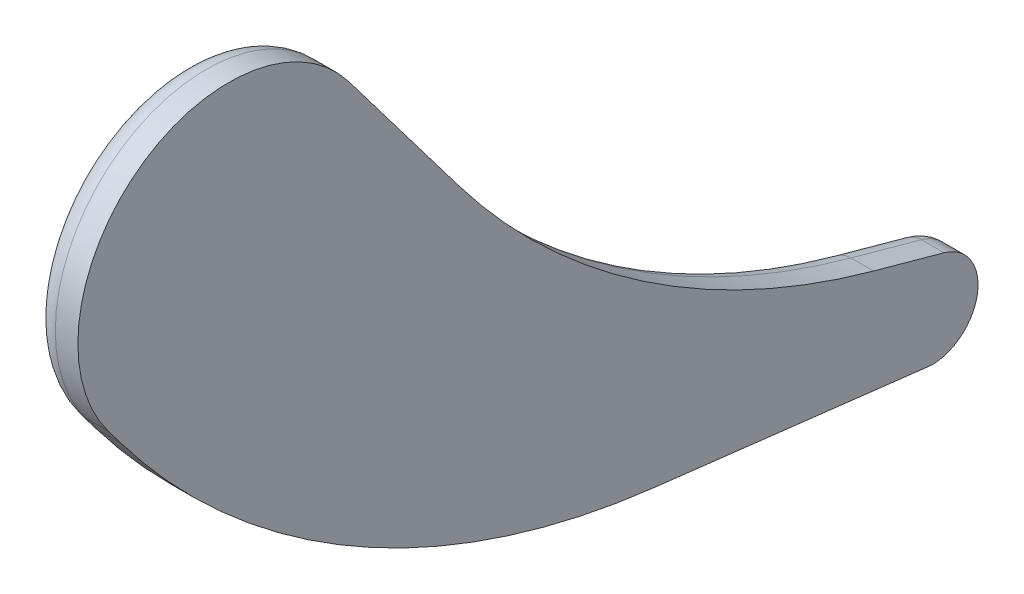
ISO-10303-21;
HEADER;
FILE_DESCRIPTION(('STEP AP214'),'2;1');
FILE_NAME('part.step','',(''),(''),'','','');
FILE_SCHEMA(('AUTOMOTIVE_DESIGN { 1 0 10303 214 1 1 1 1 }'));
ENDSEC;
DATA;
#1=APPLICATION_CONTEXT('core data for automotive mechanical design processes');
#2=APPLICATION_PROTOCOL_DEFINITION('international standard','automotive_design',2000,#1);
#3=PRODUCT_CONTEXT('',#1,'mechanical');
#4=PRODUCT('Part','Part','',(#3));
#5=PRODUCT_RELATED_PRODUCT_CATEGORY('part','',(#4));
#6=PRODUCT_DEFINITION_FORMATION('','',#4);
#7=PRODUCT_DEFINITION_CONTEXT('part definition',#1,'design');
#8=PRODUCT_DEFINITION('design','',#6,#7);
#9=PRODUCT_DEFINITION_SHAPE('','',#8);
#10=(LENGTH_UNIT() NAMED_UNIT(*) SI_UNIT(.MILLI.,.METRE.));
#11=(NAMED_UNIT(*) PLANE_ANGLE_UNIT() SI_UNIT($,.RADIAN.));
#12=(NAMED_UNIT(*) SI_UNIT($,.STERADIAN.) SOLID_ANGLE_UNIT());
#13=UNCERTAINTY_MEASURE_WITH_UNIT(LENGTH_MEASURE(1.E-05),#10,'distance_accuracy_value','');
#14=(GEOMETRIC_REPRESENTATION_CONTEXT(3) GLOBAL_UNCERTAINTY_ASSIGNED_CONTEXT((#13)) GLOBAL_UNIT_ASSIGNED_CONTEXT((#10,
#11,#12)) REPRESENTATION_CONTEXT('',''));
#15=CARTESIAN_POINT('',(0.,0.,0.));
#16=DIRECTION('',(0.,0.,1.));
#17=DIRECTION('',(1.,0.,0.));
#18=AXIS2_PLACEMENT_3D('',#15,#16,#17);
#19=CARTESIAN_POINT('',(4.064,61.3954938084868,-52.6908545838933));
#20=DIRECTION('',(-1.,0.,0.));
#21=DIRECTION('',(0.,0.,1.));
#22=AXIS2_PLACEMENT_3D('',#19,#20,#21);
#23=CYLINDRICAL_SURFACE('',#22,70.2571780129721);
#24=DIRECTION('',(-1.,0.,0.));
#25=VECTOR('',#24,1.);
#26=CARTESIAN_POINT('',(4.064,-6.33047493311499,-34.0022425338234));
#27=LINE('',#26,#25);
#28=CARTESIAN_POINT('',(4.064,-6.33047493311499,-34.0022425338234));
#29=VERTEX_POINT('',#28);
#30=CARTESIAN_POINT('',(2.032,-6.33047493311499,-34.0022425338234));
#31=VERTEX_POINT('',#30);
#32=EDGE_CURVE('E285',#29,#31,#27,.T.);
#33=ORIENTED_EDGE('',*,*,#32,.T.);
#34=CARTESIAN_POINT('',(2.032,61.3954938084868,-52.6908545838933));
#35=DIRECTION('',(1.,0.,0.));
#36=DIRECTION('',(0.,0.,-1.));
#37=AXIS2_PLACEMENT_3D('',#34,#35,#36);
#38=CIRCLE('',#37,70.2571780129721);
#39=CARTESIAN_POINT('',(2.032,18.9694256857444,3.31003653393499));
#40=VERTEX_POINT('',#39);
#41=EDGE_CURVE('E11',#31,#40,#38,.F.);
#42=ORIENTED_EDGE('',*,*,#41,.T.);
#43=DIRECTION('',(-1.,0.,0.));
#44=VECTOR('',#43,1.);
#45=CARTESIAN_POINT('',(4.064,18.9694256857444,3.31003653393499));
#46=LINE('',#45,#44);
#47=CARTESIAN_POINT('',(4.064,18.9694256857444,3.31003653393499));
#48=VERTEX_POINT('',#47);
#49=EDGE_CURVE('E313',#48,#40,#46,.T.);
#50=ORIENTED_EDGE('',*,*,#49,.F.);
#51=CARTESIAN_POINT('',(4.064,61.3954938084868,-52.6908545838933));
#52=DIRECTION('',(1.,0.,0.));
#53=DIRECTION('',(0.,0.,-1.));
#54=AXIS2_PLACEMENT_3D('',#51,#52,#53);
#55=CIRCLE('',#54,70.2571780129721);
#56=EDGE_CURVE('E257',#48,#29,#55,.T.);
#57=ORIENTED_EDGE('',*,*,#56,.T.);
#58=EDGE_LOOP('',(#33,#42,#50,#57));
#59=FACE_BOUND('',#58,.T.);
#60=ADVANCED_FACE('F46',(#59),#23,.F.);
#61=CARTESIAN_POINT('',(4.064,5.32409536328046,-7.02761528307115));
#62=DIRECTION('',(0.,0.603868093234675,-0.797084265290137));
#63=DIRECTION('',(0.,0.797084265290137,0.603868093234675));
#64=AXIS2_PLACEMENT_3D('',#61,#62,#63);
#65=PLANE('',#64);
#66=ORIENTED_EDGE('',*,*,#49,.T.);
#67=DIRECTION('',(0.,-0.797084265290137,-0.603868093234675));
#68=VECTOR('',#67,1.);
#69=CARTESIAN_POINT('',(2.032,31.9923804396434,13.1761789205946));
#70=LINE('',#69,#68);
#71=CARTESIAN_POINT('',(2.032,31.9923804396434,13.1761789205946));
#72=VERTEX_POINT('',#71);
#73=EDGE_CURVE('E342',#40,#72,#70,.F.);
#74=ORIENTED_EDGE('',*,*,#73,.T.);
#75=DIRECTION('',(-1.,0.,0.));
#76=VECTOR('',#75,1.);
#77=CARTESIAN_POINT('',(4.064,31.9923804396434,13.1761789205946));
#78=LINE('',#77,#76);
#79=CARTESIAN_POINT('',(4.064,31.9923804396434,13.1761789205946));
#80=VERTEX_POINT('',#79);
#81=EDGE_CURVE('E309',#80,#72,#78,.T.);
#82=ORIENTED_EDGE('',*,*,#81,.F.);
#83=DIRECTION('',(0.,-0.797084265290137,-0.603868093234675));
#84=VECTOR('',#83,1.);
#85=CARTESIAN_POINT('',(4.064,5.32409536328046,-7.02761528307115));
#86=LINE('',#85,#84);
#87=EDGE_CURVE('E261',#80,#48,#86,.T.);
#88=ORIENTED_EDGE('',*,*,#87,.T.);
#89=EDGE_LOOP('',(#66,#74,#82,#88));
#90=FACE_BOUND('',#89,.T.);
#91=ADVANCED_FACE('F407',(#90),#65,.T.);
#92=CARTESIAN_POINT('',(4.064,23.7918650694692,24.0005656402545));
#93=DIRECTION('',(-1.,0.,0.));
#94=DIRECTION('',(0.,0.,1.));
#95=AXIS2_PLACEMENT_3D('',#92,#93,#94);
#96=CYLINDRICAL_SURFACE('',#95,13.5799779157852);
#97=ORIENTED_EDGE('',*,*,#81,.T.);
#98=CARTESIAN_POINT('',(2.032,23.7918650694692,24.0005656402545));
#99=DIRECTION('',(1.,0.,0.));
#100=DIRECTION('',(0.,0.,-1.));
#101=AXIS2_PLACEMENT_3D('',#98,#99,#100);
#102=CIRCLE('',#101,13.5799779157852);
#103=CARTESIAN_POINT('',(2.032,15.6105357122038,34.8394608856731));
#104=VERTEX_POINT('',#103);
#105=EDGE_CURVE('E346',#72,#104,#102,.T.);
#106=ORIENTED_EDGE('',*,*,#105,.T.);
#107=DIRECTION('',(-1.,0.,0.));
#108=VECTOR('',#107,1.);
#109=CARTESIAN_POINT('',(4.064,15.6105357122038,34.8394608856731));
#110=LINE('',#109,#108);
#111=CARTESIAN_POINT('',(4.064,15.6105357122038,34.8394608856731));
#112=VERTEX_POINT('',#111);
#113=EDGE_CURVE('E305',#112,#104,#110,.T.);
#114=ORIENTED_EDGE('',*,*,#113,.F.);
#115=CARTESIAN_POINT('',(4.064,23.7918650694692,24.0005656402545));
#116=DIRECTION('',(1.,0.,0.));
#117=DIRECTION('',(0.,0.,-1.));
#118=AXIS2_PLACEMENT_3D('',#115,#116,#117);
#119=CIRCLE('',#118,13.5799779157852);
#120=EDGE_CURVE('E265',#80,#112,#119,.T.);
#121=ORIENTED_EDGE('',*,*,#120,.F.);
#122=EDGE_LOOP('',(#97,#106,#114,#121));
#123=FACE_BOUND('',#122,.T.);
#124=ADVANCED_FACE('F413',(#123),#96,.T.);
#125=CARTESIAN_POINT('',(4.064,-11.0867182492119,14.6880503731332));
#126=DIRECTION('',(0.,0.602455277026211,-0.798152641531224));
#127=DIRECTION('',(0.,0.798152641531224,0.602455277026211));
#128=AXIS2_PLACEMENT_3D('',#125,#126,#127);
#129=PLANE('',#128);
#130=ORIENTED_EDGE('',*,*,#113,.T.);
#131=DIRECTION('',(0.,-0.798152641531224,-0.602455277026211));
#132=VECTOR('',#131,1.);
#133=CARTESIAN_POINT('',(2.032,-11.0867182492119,14.6880503731332));
#134=LINE('',#133,#132);
#135=CARTESIAN_POINT('',(2.032,14.1277592112356,33.7202432308334));
#136=VERTEX_POINT('',#135);
#137=EDGE_CURVE('E349',#104,#136,#134,.T.);
#138=ORIENTED_EDGE('',*,*,#137,.T.);
#139=DIRECTION('',(-1.,0.,0.));
#140=VECTOR('',#139,1.);
#141=CARTESIAN_POINT('',(4.064,14.1277592112356,33.7202432308334));
#142=LINE('',#141,#140);
#143=CARTESIAN_POINT('',(4.064,14.1277592112356,33.7202432308334));
#144=VERTEX_POINT('',#143);
#145=EDGE_CURVE('E301',#144,#136,#142,.T.);
#146=ORIENTED_EDGE('',*,*,#145,.F.);
#147=DIRECTION('',(0.,-0.798152641531224,-0.602455277026211));
#148=VECTOR('',#147,1.);
#149=CARTESIAN_POINT('',(4.064,-11.0867182492119,14.6880503731332));
#150=LINE('',#149,#148);
#151=EDGE_CURVE('E268',#112,#144,#150,.T.);
#152=ORIENTED_EDGE('',*,*,#151,.F.);
#153=EDGE_LOOP('',(#130,#138,#146,#152));
#154=FACE_BOUND('',#153,.T.);
#155=ADVANCED_FACE('F476',(#154),#129,.F.);
#156=CARTESIAN_POINT('',(4.064,56.4545668541204,-22.3557089867498));
#157=DIRECTION('',(-1.,0.,0.));
#158=DIRECTION('',(0.,0.,1.));
#159=AXIS2_PLACEMENT_3D('',#156,#157,#158);
#160=CYLINDRICAL_SURFACE('',#159,70.2571780129719);
#161=ORIENTED_EDGE('',*,*,#145,.T.);
#162=CARTESIAN_POINT('',(2.032,56.4545668541204,-22.3557089867498));
#163=DIRECTION('',(1.,0.,0.));
#164=DIRECTION('',(0.,0.,-1.));
#165=AXIS2_PLACEMENT_3D('',#162,#163,#164);
#166=CIRCLE('',#165,70.2571780129719);
#167=CARTESIAN_POINT('',(2.032,-13.3195793217241,-14.1313799698464));
#168=VERTEX_POINT('',#167);
#169=EDGE_CURVE('E352',#136,#168,#166,.T.);
#170=ORIENTED_EDGE('',*,*,#169,.T.);
#171=DIRECTION('',(-1.,0.,0.));
#172=VECTOR('',#171,1.);
#173=CARTESIAN_POINT('',(4.064,-13.3195793217241,-14.1313799698464));
#174=LINE('',#173,#172);
#175=CARTESIAN_POINT('',(4.064,-13.3195793217241,-14.1313799698464));
#176=VERTEX_POINT('',#175);
#177=EDGE_CURVE('E297',#176,#168,#174,.T.);
#178=ORIENTED_EDGE('',*,*,#177,.F.);
#179=CARTESIAN_POINT('',(4.064,56.4545668541204,-22.3557089867498));
#180=DIRECTION('',(1.,0.,0.));
#181=DIRECTION('',(0.,0.,-1.));
#182=AXIS2_PLACEMENT_3D('',#179,#180,#181);
#183=CIRCLE('',#182,70.2571780129719);
#184=EDGE_CURVE('E271',#176,#144,#183,.F.);
#185=ORIENTED_EDGE('',*,*,#184,.T.);
#186=EDGE_LOOP('',(#161,#170,#178,#185));
#187=FACE_BOUND('',#186,.T.);
#188=ADVANCED_FACE('F449',(#187),#160,.T.);
#189=CARTESIAN_POINT('',(4.064,-11.4942084872456,1.35483065818888));
#190=DIRECTION('',(0.,0.993124804457162,-0.117060338167646));
#191=DIRECTION('',(0.,0.117060338167646,0.993124804457162));
#192=AXIS2_PLACEMENT_3D('',#189,#190,#191);
#193=PLANE('',#192);
#194=ORIENTED_EDGE('',*,*,#177,.T.);
#195=DIRECTION('',(0.,-0.117060338167646,-0.993124804457162));
#196=VECTOR('',#195,1.);
#197=CARTESIAN_POINT('',(2.032,-11.4942084872456,1.35483065818888));
#198=LINE('',#197,#196);
#199=CARTESIAN_POINT('',(2.032,-16.2786445212172,-39.2357073075474));
#200=VERTEX_POINT('',#199);
#201=EDGE_CURVE('E355',#168,#200,#198,.T.);
#202=ORIENTED_EDGE('',*,*,#201,.T.);
#203=DIRECTION('',(-1.,0.,0.));
#204=VECTOR('',#203,1.);
#205=CARTESIAN_POINT('',(4.064,-16.2786445212172,-39.2357073075474));
#206=LINE('',#205,#204);
#207=CARTESIAN_POINT('',(4.064,-16.2786445212172,-39.2357073075474));
#208=VERTEX_POINT('',#207);
#209=EDGE_CURVE('E293',#208,#200,#206,.T.);
#210=ORIENTED_EDGE('',*,*,#209,.F.);
#211=DIRECTION('',(0.,-0.117060338167646,-0.993124804457162));
#212=VECTOR('',#211,1.);
#213=CARTESIAN_POINT('',(4.064,-11.4942084872456,1.35483065818888));
#214=LINE('',#213,#212);
#215=EDGE_CURVE('E275',#176,#208,#214,.T.);
#216=ORIENTED_EDGE('',*,*,#215,.F.);
#217=EDGE_LOOP('',(#194,#202,#210,#216));
#218=FACE_BOUND('',#217,.T.);
#219=ADVANCED_FACE('F454',(#218),#193,.F.);
#220=CARTESIAN_POINT('',(4.064,-12.1046331055293,-39.2357073075474));
#221=DIRECTION('',(-1.,0.,0.));
#222=DIRECTION('',(0.,0.,1.));
#223=AXIS2_PLACEMENT_3D('',#220,#221,#222);
#224=CYLINDRICAL_SURFACE('',#223,4.17401141568788);
#225=ORIENTED_EDGE('',*,*,#209,.T.);
#226=CARTESIAN_POINT('',(2.032,-12.1046331055293,-39.2357073075474));
#227=DIRECTION('',(1.,0.,0.));
#228=DIRECTION('',(0.,0.,-1.));
#229=AXIS2_PLACEMENT_3D('',#226,#227,#228);
#230=CIRCLE('',#229,4.17401141568788);
#231=CARTESIAN_POINT('',(2.032,-8.08100200247289,-40.346006386539));
#232=VERTEX_POINT('',#231);
#233=EDGE_CURVE('E358',#200,#232,#230,.T.);
#234=ORIENTED_EDGE('',*,*,#233,.T.);
#235=DIRECTION('',(-1.,0.,0.));
#236=VECTOR('',#235,1.);
#237=CARTESIAN_POINT('',(4.064,-8.08100200247289,-40.346006386539));
#238=LINE('',#237,#236);
#239=CARTESIAN_POINT('',(4.064,-8.08100200247289,-40.346006386539));
#240=VERTEX_POINT('',#239);
#241=EDGE_CURVE('E289',#240,#232,#238,.T.);
#242=ORIENTED_EDGE('',*,*,#241,.F.);
#243=CARTESIAN_POINT('',(4.064,-12.1046331055293,-39.2357073075474));
#244=DIRECTION('',(1.,0.,0.));
#245=DIRECTION('',(0.,0.,-1.));
#246=AXIS2_PLACEMENT_3D('',#243,#244,#245);
#247=CIRCLE('',#246,4.17401141568788);
#248=EDGE_CURVE('E278',#208,#240,#247,.T.);
#249=ORIENTED_EDGE('',*,*,#248,.F.);
#250=EDGE_LOOP('',(#225,#234,#242,#249));
#251=FACE_BOUND('',#250,.T.);
#252=ADVANCED_FACE('F464',(#251),#224,.T.);
#253=CARTESIAN_POINT('',(4.064,2.83628832722713,-0.78265830957587));
#254=DIRECTION('',(0.,0.963972232546787,-0.266002885094809));
#255=DIRECTION('',(0.,0.266002885094809,0.963972232546788));
#256=AXIS2_PLACEMENT_3D('',#253,#254,#255);
#257=PLANE('',#256);
#258=ORIENTED_EDGE('',*,*,#241,.T.);
#259=DIRECTION('',(0.,-0.266002885094809,-0.963972232546788));
#260=VECTOR('',#259,1.);
#261=CARTESIAN_POINT('',(2.032,-6.330474933115,-34.0022425338234));
#262=LINE('',#261,#260);
#263=EDGE_CURVE('E56',#232,#31,#262,.F.);
#264=ORIENTED_EDGE('',*,*,#263,.T.);
#265=ORIENTED_EDGE('',*,*,#32,.F.);
#266=DIRECTION('',(0.,-0.266002885094809,-0.963972232546788));
#267=VECTOR('',#266,1.);
#268=CARTESIAN_POINT('',(4.064,2.83628832722713,-0.78265830957587));
#269=LINE('',#268,#267);
#270=EDGE_CURVE('E281',#29,#240,#269,.T.);
#271=ORIENTED_EDGE('',*,*,#270,.T.);
#272=EDGE_LOOP('',(#258,#264,#265,#271));
#273=FACE_BOUND('',#272,.T.);
#274=ADVANCED_FACE('F467',(#273),#257,.T.);
#275=CARTESIAN_POINT('',(4.064,0.,0.));
#276=DIRECTION('',(1.,0.,0.));
#277=DIRECTION('',(0.,0.,-1.));
#278=AXIS2_PLACEMENT_3D('',#275,#276,#277);
#279=PLANE('',#278);
#280=ORIENTED_EDGE('',*,*,#56,.F.);
#281=ORIENTED_EDGE('',*,*,#87,.F.);
#282=ORIENTED_EDGE('',*,*,#120,.T.);
#283=ORIENTED_EDGE('',*,*,#151,.T.);
#284=ORIENTED_EDGE('',*,*,#184,.F.);
#285=ORIENTED_EDGE('',*,*,#215,.T.);
#286=ORIENTED_EDGE('',*,*,#248,.T.);
#287=ORIENTED_EDGE('',*,*,#270,.F.);
#288=EDGE_LOOP('',(#280,#281,#282,#283,#284,#285,#286,#287));
#289=FACE_BOUND('',#288,.T.);
#290=ADVANCED_FACE('F403',(#289),#279,.T.);
#291=CARTESIAN_POINT('',(0.,0.,0.));
#292=DIRECTION('',(1.,0.,0.));
#293=DIRECTION('',(0.,0.,-1.));
#294=AXIS2_PLACEMENT_3D('',#291,#292,#293);
#295=PLANE('',#294);
#296=CARTESIAN_POINT('',(0.,25.0422729747218,26.4435534532811));
#297=CARTESIAN_POINT('',(0.,-8.790895669463,11.7451742346786));
#298=CARTESIAN_POINT('',(0.,-9.53135443547078,-25.7954310278129));
#299=B_SPLINE_CURVE_WITH_KNOTS('',2,(#296,#297,#298),.UNSPECIFIED.,.F.,.F.,(3,3),(0.,1.),.UNSPECIFIED.);
#300=CARTESIAN_POINT('',(0.,25.0422729747218,26.4435534532811));
#301=VERTEX_POINT('',#300);
#302=CARTESIAN_POINT('',(0.,-9.53135443547078,-25.7954310278129));
#303=VERTEX_POINT('',#302);
#304=EDGE_CURVE('E171',#301,#303,#299,.T.);
#305=ORIENTED_EDGE('',*,*,#304,.F.);
#306=CARTESIAN_POINT('',(0.,-9.53135443547078,-25.7954310278129));
#307=CARTESIAN_POINT('',(0.,-10.697163697347,16.0157696724459));
#308=CARTESIAN_POINT('',(0.,25.0422729747218,26.4435534532811));
#309=B_SPLINE_CURVE_WITH_KNOTS('',2,(#306,#307,#308),.UNSPECIFIED.,.F.,.F.,(3,3),(0.,1.),.UNSPECIFIED.);
#310=EDGE_CURVE('E64',#303,#301,#309,.T.);
#311=ORIENTED_EDGE('',*,*,#310,.F.);
#312=EDGE_LOOP('',(#305,#311));
#313=FACE_BOUND('',#312,.T.);
#314=CARTESIAN_POINT('',(0.,29.5006726164255,20.7233425922273));
#315=CARTESIAN_POINT('',(0.,3.71117736714563,4.62133884209504));
#316=CARTESIAN_POINT('',(0.,-7.26009424064061,-24.1130160686794));
#317=B_SPLINE_CURVE_WITH_KNOTS('',2,(#314,#315,#316),.UNSPECIFIED.,.F.,.F.,(3,3),(0.,1.),.UNSPECIFIED.);
#318=CARTESIAN_POINT('',(0.,29.5006726164255,20.7233425922273));
#319=VERTEX_POINT('',#318);
#320=CARTESIAN_POINT('',(0.,-7.26009424064061,-24.1130160686794));
#321=VERTEX_POINT('',#320);
#322=EDGE_CURVE('E181',#319,#321,#317,.T.);
#323=ORIENTED_EDGE('',*,*,#322,.F.);
#324=CARTESIAN_POINT('',(0.,-7.26009424064061,-24.1130160686794));
#325=CARTESIAN_POINT('',(0.,-0.295619762000161,8.1687652311327));
#326=CARTESIAN_POINT('',(0.,29.5006726164255,20.7233425922273));
#327=B_SPLINE_CURVE_WITH_KNOTS('',2,(#324,#325,#326),.UNSPECIFIED.,.F.,.F.,(3,3),(0.,1.),.UNSPECIFIED.);
#328=EDGE_CURVE('E72',#321,#319,#327,.T.);
#329=ORIENTED_EDGE('',*,*,#328,.F.);
#330=EDGE_LOOP('',(#323,#329));
#331=FACE_BOUND('',#330,.T.);
#332=CARTESIAN_POINT('',(0.,23.7918650694692,24.0005656402545));
#333=DIRECTION('',(1.,0.,0.));
#334=DIRECTION('',(0.,0.,-1.));
#335=AXIS2_PLACEMENT_3D('',#332,#333,#334);
#336=CIRCLE('',#335,11.5479779157852);
#337=CARTESIAN_POINT('',(0.,16.8347248351212,33.2176147180818));
#338=VERTEX_POINT('',#337);
#339=CARTESIAN_POINT('',(0.,30.7653204741906,14.7958541476642));
#340=VERTEX_POINT('',#339);
#341=EDGE_CURVE('E335',#338,#340,#336,.F.);
#342=ORIENTED_EDGE('',*,*,#341,.T.);
#343=DIRECTION('',(0.,-0.797084265290137,-0.603868093234675));
#344=VECTOR('',#343,1.);
#345=CARTESIAN_POINT('',(0.,17.7423657202915,4.92971176100455));
#346=LINE('',#345,#344);
#347=CARTESIAN_POINT('',(0.,17.7423657202915,4.92971176100454));
#348=VERTEX_POINT('',#347);
#349=EDGE_CURVE('E338',#340,#348,#346,.T.);
#350=ORIENTED_EDGE('',*,*,#349,.T.);
#351=CARTESIAN_POINT('',(0.,61.3954938084868,-52.6908545838933));
#352=DIRECTION('',(1.,0.,0.));
#353=DIRECTION('',(0.,0.,-1.));
#354=AXIS2_PLACEMENT_3D('',#351,#352,#353);
#355=CIRCLE('',#354,72.2891780129721);
#356=CARTESIAN_POINT('',(0.,-8.28926650965007,-33.4617246713108));
#357=VERTEX_POINT('',#356);
#358=EDGE_CURVE('E317',#348,#357,#355,.T.);
#359=ORIENTED_EDGE('',*,*,#358,.T.);
#360=DIRECTION('',(0.,-0.266002885094809,-0.963972232546788));
#361=VECTOR('',#360,1.);
#362=CARTESIAN_POINT('',(0.,-10.039793579008,-39.8054885240264));
#363=LINE('',#362,#361);
#364=CARTESIAN_POINT('',(0.,-10.039793579008,-39.8054885240264));
#365=VERTEX_POINT('',#364);
#366=EDGE_CURVE('E320',#357,#365,#363,.T.);
#367=ORIENTED_EDGE('',*,*,#366,.T.);
#368=CARTESIAN_POINT('',(0.,-12.1046331055293,-39.2357073075474));
#369=DIRECTION('',(1.,0.,0.));
#370=DIRECTION('',(0.,0.,-1.));
#371=AXIS2_PLACEMENT_3D('',#368,#369,#370);
#372=CIRCLE('',#371,2.14201141568788);
#373=CARTESIAN_POINT('',(0.,-14.2443247289104,-39.3353700476752));
#374=VERTEX_POINT('',#373);
#375=EDGE_CURVE('E323',#365,#374,#372,.F.);
#376=ORIENTED_EDGE('',*,*,#375,.T.);
#377=DIRECTION('',(0.,-0.117060338167646,-0.993124804457162));
#378=VECTOR('',#377,1.);
#379=CARTESIAN_POINT('',(0.,-9.47617888458868,1.11696405103223));
#380=LINE('',#379,#378);
#381=CARTESIAN_POINT('',(0.,-11.3015497190671,-14.3692465770031));
#382=VERTEX_POINT('',#381);
#383=EDGE_CURVE('E326',#374,#382,#380,.F.);
#384=ORIENTED_EDGE('',*,*,#383,.T.);
#385=CARTESIAN_POINT('',(0.,56.4545668541204,-22.3557089867498));
#386=DIRECTION('',(1.,0.,0.));
#387=DIRECTION('',(0.,0.,-1.));
#388=AXIS2_PLACEMENT_3D('',#385,#386,#387);
#389=CIRCLE('',#388,68.2251780129719);
#390=CARTESIAN_POINT('',(0.,15.351948334153,32.0983970632418));
#391=VERTEX_POINT('',#390);
#392=EDGE_CURVE('E329',#382,#391,#389,.F.);
#393=ORIENTED_EDGE('',*,*,#392,.T.);
#394=DIRECTION('',(0.,-0.798152641531224,-0.602455277026211));
#395=VECTOR('',#394,1.);
#396=CARTESIAN_POINT('',(0.,-9.86252912629467,13.0662042055418));
#397=LINE('',#396,#395);
#398=EDGE_CURVE('E332',#391,#338,#397,.F.);
#399=ORIENTED_EDGE('',*,*,#398,.T.);
#400=EDGE_LOOP('',(#342,#350,#359,#367,#376,#384,#393,#399));
#401=FACE_BOUND('',#400,.T.);
#402=ADVANCED_FACE('F176',(#313,#331,#401),#295,.F.);
#403=CARTESIAN_POINT('',(2.032,-9.47617888458869,1.11696405103223));
#404=DIRECTION('',(0.,-0.117060338167646,-0.993124804457162));
#405=DIRECTION('',(0.,0.993124804457162,-0.117060338167646));
#406=AXIS2_PLACEMENT_3D('',#403,#404,#405);
#407=CYLINDRICAL_SURFACE('',#406,2.032);
#408=CARTESIAN_POINT('',(2.032,-16.2786445212172,-39.2357073075474));
#409=CARTESIAN_POINT('',(1.97490913522424,-16.2786441679613,-39.2357071301812));
#410=CARTESIAN_POINT('',(1.91784564197201,-16.2762369801685,-39.2358487301557));
#411=CARTESIAN_POINT('',(1.80412739165058,-16.2666339179411,-39.2364123251686));
#412=CARTESIAN_POINT('',(1.74747261408578,-16.2594382853407,-39.2368343060466));
#413=CARTESIAN_POINT('',(1.57882639841227,-16.2307369301694,-39.2385142820201));
#414=CARTESIAN_POINT('',(1.46796538606308,-16.2021165624859,-39.2401863318162));
#415=CARTESIAN_POINT('',(1.25263506053405,-16.126702402133,-39.244553398101));
#416=CARTESIAN_POINT('',(1.14816872944709,-16.0799002041785,-39.247248887703));
#417=CARTESIAN_POINT('',(0.948590742954448,-15.9694638762637,-39.2535275307053));
#418=CARTESIAN_POINT('',(0.853477019451046,-15.9058334789771,-39.2571104872448));
#419=CARTESIAN_POINT('',(0.67523182930003,-15.7635067678171,-39.2649845993989));
#420=CARTESIAN_POINT('',(0.592107388592633,-15.6848016822782,-39.2692761671389));
#421=CARTESIAN_POINT('',(0.440218097068121,-15.5145541278173,-39.2783442101934));
#422=CARTESIAN_POINT('',(0.371457814015909,-15.4230075907686,-39.2831208390408));
#423=CARTESIAN_POINT('',(0.250148462128031,-15.2295297924234,-39.2929091332432));
#424=CARTESIAN_POINT('',(0.197629317419439,-15.1275798169764,-39.2979212130799));
#425=CARTESIAN_POINT('',(0.110466724342507,-14.9163476607062,-39.3078877802877));
#426=CARTESIAN_POINT('',(0.0758093765925047,-14.8070712561002,-39.3128423094989));
#427=CARTESIAN_POINT('',(0.0344752484483149,-14.6249427675017,-39.3206540296102));
#428=CARTESIAN_POINT('',(0.0222056806132383,-14.5533081107696,-39.3236182945805));
#429=CARTESIAN_POINT('',(0.0053772290070184,-14.4092030069076,-39.3293244998339));
#430=CARTESIAN_POINT('',(0.000805865032638335,-14.3367341046935,-39.3320667930886));
#431=CARTESIAN_POINT('',(3.23960002930879E-05,-14.2576256415239,-39.33489783133));
#432=CARTESIAN_POINT('',(-8.52278166634812E-08,-14.2509749499781,-39.3351345840586));
#433=CARTESIAN_POINT('',(0.,-14.2443247289104,-39.335370047675));
#434=B_SPLINE_CURVE_WITH_KNOTS('',3,(#408,#409,#410,#411,#412,#413,#414,#415,#416,#417,#418,
#419,#420,#421,#422,#423,#424,#425,#426,#427,#428,#429,#430,#431,#432,#433),.UNSPECIFIED.,.F.,
.F.,(4,2,2,2,2,2,2,2,2,2,2,2,4),(0.,0.171167327728764,0.34232601153386,0.684087476598604,
1.02600712307114,1.36785099164416,1.7098943800982,2.05204637244601,2.39482507101977,
2.73733662776694,2.95519626989932,3.17270238028775,3.1926669537981),.UNSPECIFIED.);
#435=EDGE_CURVE('E383',#200,#374,#434,.T.);
#436=ORIENTED_EDGE('',*,*,#435,.F.);
#437=ORIENTED_EDGE('',*,*,#201,.F.);
#438=CARTESIAN_POINT('',(2.032,-11.3015497190671,-14.3692465770031));
#439=DIRECTION('',(0.,0.117060338167653,0.993124804457161));
#440=DIRECTION('',(0.,-0.993124804457161,0.117060338167653));
#441=AXIS2_PLACEMENT_3D('',#438,#439,#440);
#442=CIRCLE('',#441,2.032);
#443=EDGE_CURVE('E50',#382,#168,#442,.T.);
#444=ORIENTED_EDGE('',*,*,#443,.F.);
#445=ORIENTED_EDGE('',*,*,#383,.F.);
#446=EDGE_LOOP('',(#436,#437,#444,#445));
#447=FACE_BOUND('',#446,.T.);
#448=ADVANCED_FACE('F394',(#447),#407,.T.);
#449=CARTESIAN_POINT('',(2.032,56.4545668541204,-22.3557089867498));
#450=DIRECTION('',(1.,0.,0.));
#451=DIRECTION('',(0.,0.,-1.));
#452=AXIS2_PLACEMENT_3D('',#449,#450,#451);
#453=TOROIDAL_SURFACE('',#452,68.2251780129719,2.032);
#454=ORIENTED_EDGE('',*,*,#443,.T.);
#455=ORIENTED_EDGE('',*,*,#169,.F.);
#456=CARTESIAN_POINT('',(2.032,15.351948334153,32.0983970632418));
#457=DIRECTION('',(0.,0.798152641531226,0.602455277026209));
#458=DIRECTION('',(0.,-0.602455277026209,0.798152641531226));
#459=AXIS2_PLACEMENT_3D('',#456,#457,#458);
#460=CIRCLE('',#459,2.032);
#461=EDGE_CURVE('E380',#391,#136,#460,.T.);
#462=ORIENTED_EDGE('',*,*,#461,.F.);
#463=ORIENTED_EDGE('',*,*,#392,.F.);
#464=EDGE_LOOP('',(#454,#455,#462,#463));
#465=FACE_BOUND('',#464,.T.);
#466=ADVANCED_FACE('F48',(#465),#453,.T.);
#467=CARTESIAN_POINT('',(2.032,-12.1046331055293,-39.2357073075474));
#468=DIRECTION('',(1.,0.,0.));
#469=DIRECTION('',(0.,0.,-1.));
#470=AXIS2_PLACEMENT_3D('',#467,#468,#469);
#471=TOROIDAL_SURFACE('',#470,2.14201141568788,2.032);
#472=ORIENTED_EDGE('',*,*,#435,.T.);
#473=ORIENTED_EDGE('',*,*,#375,.F.);
#474=CARTESIAN_POINT('',(2.032,-10.039793579008,-39.8054885240264));
#475=DIRECTION('',(0.,0.266002885094809,0.963972232546788));
#476=DIRECTION('',(0.,-0.963972232546788,0.266002885094809));
#477=AXIS2_PLACEMENT_3D('',#474,#475,#476);
#478=CIRCLE('',#477,2.032);
#479=EDGE_CURVE('E376',#232,#365,#478,.T.);
#480=ORIENTED_EDGE('',*,*,#479,.F.);
#481=ORIENTED_EDGE('',*,*,#233,.F.);
#482=EDGE_LOOP('',(#472,#473,#480,#481));
#483=FACE_BOUND('',#482,.T.);
#484=ADVANCED_FACE('F391',(#483),#471,.T.);
#485=CARTESIAN_POINT('',(2.032,-9.86252912629467,13.0662042055418));
#486=DIRECTION('',(0.,-0.798152641531224,-0.602455277026211));
#487=DIRECTION('',(0.,0.602455277026211,-0.798152641531224));
#488=AXIS2_PLACEMENT_3D('',#485,#486,#487);
#489=CYLINDRICAL_SURFACE('',#488,2.032);
#490=ORIENTED_EDGE('',*,*,#461,.T.);
#491=ORIENTED_EDGE('',*,*,#137,.F.);
#492=CARTESIAN_POINT('',(2.032,16.8347248351212,33.2176147180818));
#493=DIRECTION('',(0.,0.798152641531152,0.602455277026308));
#494=DIRECTION('',(0.,-0.602455277026308,0.798152641531151));
#495=AXIS2_PLACEMENT_3D('',#492,#493,#494);
#496=CIRCLE('',#495,2.032);
#497=EDGE_CURVE('E372',#338,#104,#496,.T.);
#498=ORIENTED_EDGE('',*,*,#497,.F.);
#499=ORIENTED_EDGE('',*,*,#398,.F.);
#500=EDGE_LOOP('',(#490,#491,#498,#499));
#501=FACE_BOUND('',#500,.T.);
#502=ADVANCED_FACE('F432',(#501),#489,.T.);
#503=CARTESIAN_POINT('',(2.032,0.877496750692056,-0.242140447063218));
#504=DIRECTION('',(0.,0.266002885094809,0.963972232546788));
#505=DIRECTION('',(0.,-0.963972232546787,0.266002885094809));
#506=AXIS2_PLACEMENT_3D('',#503,#504,#505);
#507=CYLINDRICAL_SURFACE('',#506,2.032);
#508=ORIENTED_EDGE('',*,*,#479,.T.);
#509=ORIENTED_EDGE('',*,*,#366,.F.);
#510=CARTESIAN_POINT('',(2.032,-8.28926650965007,-33.4617246713108));
#511=DIRECTION('',(0.,0.266002885094809,0.963972232546788));
#512=DIRECTION('',(0.,-0.963972232546788,0.266002885094809));
#513=AXIS2_PLACEMENT_3D('',#510,#511,#512);
#514=CIRCLE('',#513,2.032);
#515=EDGE_CURVE('E368',#31,#357,#514,.T.);
#516=ORIENTED_EDGE('',*,*,#515,.F.);
#517=ORIENTED_EDGE('',*,*,#263,.F.);
#518=EDGE_LOOP('',(#508,#509,#516,#517));
#519=FACE_BOUND('',#518,.T.);
#520=ADVANCED_FACE('F429',(#519),#507,.T.);
#521=CARTESIAN_POINT('',(2.032,23.7918650694692,24.0005656402545));
#522=DIRECTION('',(1.,0.,0.));
#523=DIRECTION('',(0.,0.,-1.));
#524=AXIS2_PLACEMENT_3D('',#521,#522,#523);
#525=TOROIDAL_SURFACE('',#524,11.5479779157852,2.032);
#526=ORIENTED_EDGE('',*,*,#497,.T.);
#527=ORIENTED_EDGE('',*,*,#105,.F.);
#528=CARTESIAN_POINT('',(2.032,30.7653204741906,14.7958541476642));
#529=DIRECTION('',(0.,-0.797084265290138,-0.603868093234674));
#530=DIRECTION('',(0.,0.603868093234674,-0.797084265290138));
#531=AXIS2_PLACEMENT_3D('',#528,#529,#530);
#532=CIRCLE('',#531,2.032);
#533=EDGE_CURVE('E365',#340,#72,#532,.T.);
#534=ORIENTED_EDGE('',*,*,#533,.F.);
#535=ORIENTED_EDGE('',*,*,#341,.F.);
#536=EDGE_LOOP('',(#526,#527,#534,#535));
#537=FACE_BOUND('',#536,.T.);
#538=ADVANCED_FACE('F425',(#537),#525,.T.);
#539=CARTESIAN_POINT('',(2.032,61.3954938084868,-52.6908545838933));
#540=DIRECTION('',(1.,0.,0.));
#541=DIRECTION('',(0.,0.,-1.));
#542=AXIS2_PLACEMENT_3D('',#539,#540,#541);
#543=TOROIDAL_SURFACE('',#542,72.2891780129721,2.032);
#544=ORIENTED_EDGE('',*,*,#515,.T.);
#545=ORIENTED_EDGE('',*,*,#358,.F.);
#546=CARTESIAN_POINT('',(2.032,17.7423657202915,4.92971176100454));
#547=DIRECTION('',(0.,0.797084265290139,0.603868093234673));
#548=DIRECTION('',(0.,-0.603868093234673,0.797084265290139));
#549=AXIS2_PLACEMENT_3D('',#546,#547,#548);
#550=CIRCLE('',#549,2.032);
#551=EDGE_CURVE('E254',#40,#348,#550,.T.);
#552=ORIENTED_EDGE('',*,*,#551,.F.);
#553=ORIENTED_EDGE('',*,*,#41,.F.);
#554=EDGE_LOOP('',(#544,#545,#552,#553));
#555=FACE_BOUND('',#554,.T.);
#556=ADVANCED_FACE('F421',(#555),#543,.T.);
#557=CARTESIAN_POINT('',(2.032,4.0970353978276,-5.40794005600159));
#558=DIRECTION('',(0.,0.797084265290137,0.603868093234675));
#559=DIRECTION('',(0.,-0.603868093234675,0.797084265290137));
#560=AXIS2_PLACEMENT_3D('',#557,#558,#559);
#561=CYLINDRICAL_SURFACE('',#560,2.032);
#562=ORIENTED_EDGE('',*,*,#533,.T.);
#563=ORIENTED_EDGE('',*,*,#73,.F.);
#564=ORIENTED_EDGE('',*,*,#551,.T.);
#565=ORIENTED_EDGE('',*,*,#349,.F.);
#566=EDGE_LOOP('',(#562,#563,#564,#565));
#567=FACE_BOUND('',#566,.T.);
#568=ADVANCED_FACE('F418',(#567),#561,.T.);
#569=CARTESIAN_POINT('',(2.032,-7.26009424064061,-24.1130160686794));
#570=CARTESIAN_POINT('',(2.032,-0.295619762000161,8.1687652311327));
#571=CARTESIAN_POINT('',(2.032,29.5006726164255,20.7233425922273));
#572=B_SPLINE_CURVE_WITH_KNOTS('',2,(#569,#570,#571),.UNSPECIFIED.,.F.,.F.,(3,3),(0.,1.),.UNSPECIFIED.);
#573=DIRECTION('',(-1.,0.,0.));
#574=VECTOR('',#573,1.);
#575=SURFACE_OF_LINEAR_EXTRUSION('',#572,#574);
#576=ORIENTED_EDGE('',*,*,#328,.T.);
#577=DIRECTION('',(-1.,0.,0.));
#578=VECTOR('',#577,1.);
#579=CARTESIAN_POINT('',(2.032,29.5006726164255,20.7233425922273));
#580=LINE('',#579,#578);
#581=CARTESIAN_POINT('',(2.032,29.5006726164255,20.7233425922273));
#582=VERTEX_POINT('',#581);
#583=EDGE_CURVE('E229',#582,#319,#580,.T.);
#584=ORIENTED_EDGE('',*,*,#583,.F.);
#585=CARTESIAN_POINT('',(2.032,-7.26009424064061,-24.1130160686794));
#586=VERTEX_POINT('',#585);
#587=EDGE_CURVE('E230',#586,#582,#572,.T.);
#588=ORIENTED_EDGE('',*,*,#587,.F.);
#589=DIRECTION('',(-1.,0.,0.));
#590=VECTOR('',#589,1.);
#591=CARTESIAN_POINT('',(2.032,-7.26009424064061,-24.1130160686794));
#592=LINE('',#591,#590);
#593=EDGE_CURVE('E248',#586,#321,#592,.T.);
#594=ORIENTED_EDGE('',*,*,#593,.T.);
#595=EDGE_LOOP('',(#576,#584,#588,#594));
#596=FACE_BOUND('',#595,.T.);
#597=ADVANCED_FACE('F220',(#596),#575,.F.);
#598=CARTESIAN_POINT('',(2.032,29.5006726164255,20.7233425922273));
#599=CARTESIAN_POINT('',(2.032,3.71117736714563,4.62133884209504));
#600=CARTESIAN_POINT('',(2.032,-7.26009424064061,-24.1130160686794));
#601=B_SPLINE_CURVE_WITH_KNOTS('',2,(#598,#599,#600),.UNSPECIFIED.,.F.,.F.,(3,3),(0.,1.),.UNSPECIFIED.);
#602=DIRECTION('',(-1.,0.,0.));
#603=VECTOR('',#602,1.);
#604=SURFACE_OF_LINEAR_EXTRUSION('',#601,#603);
#605=ORIENTED_EDGE('',*,*,#322,.T.);
#606=ORIENTED_EDGE('',*,*,#593,.F.);
#607=EDGE_CURVE('E223',#582,#586,#601,.T.);
#608=ORIENTED_EDGE('',*,*,#607,.F.);
#609=ORIENTED_EDGE('',*,*,#583,.T.);
#610=EDGE_LOOP('',(#605,#606,#608,#609));
#611=FACE_BOUND('',#610,.T.);
#612=ADVANCED_FACE('F215',(#611),#604,.F.);
#613=CARTESIAN_POINT('',(2.032,5.41233471294614,3.23696424645333));
#614=DIRECTION('',(-1.,0.,0.));
#615=DIRECTION('',(0.,0.,1.));
#616=AXIS2_PLACEMENT_3D('',#613,#614,#615);
#617=PLANE('',#616);
#618=ORIENTED_EDGE('',*,*,#587,.T.);
#619=ORIENTED_EDGE('',*,*,#607,.T.);
#620=EDGE_LOOP('',(#618,#619));
#621=FACE_BOUND('',#620,.T.);
#622=ADVANCED_FACE('F212',(#621),#617,.T.);
#623=CARTESIAN_POINT('',(2.032,-9.53135443547078,-25.7954310278129));
#624=CARTESIAN_POINT('',(2.032,-10.697163697347,16.0157696724459));
#625=CARTESIAN_POINT('',(2.032,25.0422729747218,26.4435534532811));
#626=B_SPLINE_CURVE_WITH_KNOTS('',2,(#623,#624,#625),.UNSPECIFIED.,.F.,.F.,(3,3),(0.,1.),.UNSPECIFIED.);
#627=DIRECTION('',(-1.,0.,0.));
#628=VECTOR('',#627,1.);
#629=SURFACE_OF_LINEAR_EXTRUSION('',#626,#628);
#630=ORIENTED_EDGE('',*,*,#310,.T.);
#631=DIRECTION('',(-1.,0.,0.));
#632=VECTOR('',#631,1.);
#633=CARTESIAN_POINT('',(2.032,25.0422729747218,26.4435534532811));
#634=LINE('',#633,#632);
#635=CARTESIAN_POINT('',(2.032,25.0422729747218,26.4435534532811));
#636=VERTEX_POINT('',#635);
#637=EDGE_CURVE('E168',#636,#301,#634,.T.);
#638=ORIENTED_EDGE('',*,*,#637,.F.);
#639=CARTESIAN_POINT('',(2.032,-9.53135443547078,-25.7954310278129));
#640=VERTEX_POINT('',#639);
#641=EDGE_CURVE('E163',#640,#636,#626,.T.);
#642=ORIENTED_EDGE('',*,*,#641,.F.);
#643=DIRECTION('',(-1.,0.,0.));
#644=VECTOR('',#643,1.);
#645=CARTESIAN_POINT('',(2.032,-9.53135443547078,-25.7954310278129));
#646=LINE('',#645,#644);
#647=EDGE_CURVE('E159',#640,#303,#646,.T.);
#648=ORIENTED_EDGE('',*,*,#647,.T.);
#649=EDGE_LOOP('',(#630,#638,#642,#648));
#650=FACE_BOUND('',#649,.T.);
#651=ADVANCED_FACE('F161',(#650),#629,.F.);
#652=CARTESIAN_POINT('',(2.032,25.0422729747218,26.4435534532811));
#653=CARTESIAN_POINT('',(2.032,-8.790895669463,11.7451742346786));
#654=CARTESIAN_POINT('',(2.032,-9.53135443547078,-25.7954310278129));
#655=B_SPLINE_CURVE_WITH_KNOTS('',2,(#652,#653,#654),.UNSPECIFIED.,.F.,.F.,(3,3),(0.,1.),.UNSPECIFIED.);
#656=DIRECTION('',(-1.,0.,0.));
#657=VECTOR('',#656,1.);
#658=SURFACE_OF_LINEAR_EXTRUSION('',#655,#657);
#659=ORIENTED_EDGE('',*,*,#304,.T.);
#660=ORIENTED_EDGE('',*,*,#647,.F.);
#661=EDGE_CURVE('E188',#636,#640,#655,.T.);
#662=ORIENTED_EDGE('',*,*,#661,.F.);
#663=ORIENTED_EDGE('',*,*,#637,.T.);
#664=EDGE_LOOP('',(#659,#660,#662,#663));
#665=FACE_BOUND('',#664,.T.);
#666=ADVANCED_FACE('F172',(#665),#658,.F.);
#667=CARTESIAN_POINT('',(2.032,-1.47085221386072,8.16991544259002));
#668=DIRECTION('',(-1.,0.,0.));
#669=DIRECTION('',(0.,0.,1.));
#670=AXIS2_PLACEMENT_3D('',#667,#668,#669);
#671=PLANE('',#670);
#672=ORIENTED_EDGE('',*,*,#641,.T.);
#673=ORIENTED_EDGE('',*,*,#661,.T.);
#674=EDGE_LOOP('',(#672,#673));
#675=FACE_BOUND('',#674,.T.);
#676=ADVANCED_FACE('F208',(#675),#671,.T.);
#677=CLOSED_SHELL('',(#60,#91,#124,#155,#188,#219,#252,#274,#290,#402,#448,#466,#484,#502,#520,
#538,#556,#568,#597,#612,#622,#651,#666,#676));
#678=MANIFOLD_SOLID_BREP('B2',#677);
#679=ADVANCED_BREP_SHAPE_REPRESENTATION('',(#18,#678),#14);
#680=SHAPE_DEFINITION_REPRESENTATION(#9,#679);
ENDSEC;
END-ISO-10303-21;
